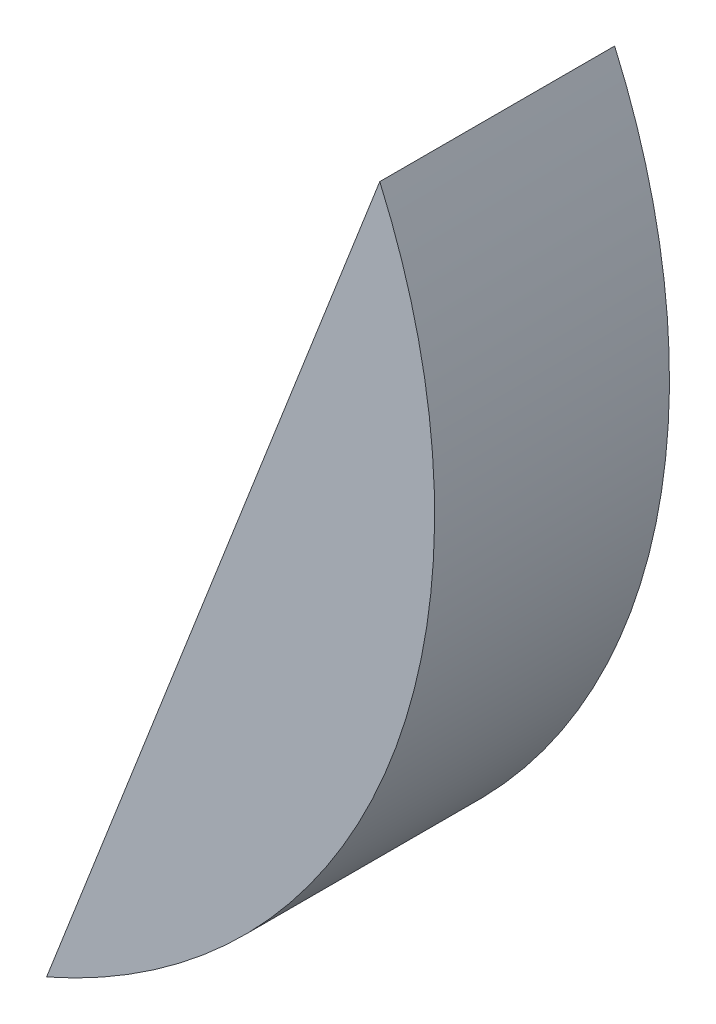
ISO-10303-21;
HEADER;
FILE_DESCRIPTION(('STEP AP214'),'2;1');
FILE_NAME('part.step','',(''),(''),'','','');
FILE_SCHEMA(('AUTOMOTIVE_DESIGN { 1 0 10303 214 1 1 1 1 }'));
ENDSEC;
DATA;
#1=APPLICATION_CONTEXT('core data for automotive mechanical design processes');
#2=APPLICATION_PROTOCOL_DEFINITION('international standard','automotive_design',2000,#1);
#3=PRODUCT_CONTEXT('',#1,'mechanical');
#4=PRODUCT('Part','Part','',(#3));
#5=PRODUCT_RELATED_PRODUCT_CATEGORY('part','',(#4));
#6=PRODUCT_DEFINITION_FORMATION('','',#4);
#7=PRODUCT_DEFINITION_CONTEXT('part definition',#1,'design');
#8=PRODUCT_DEFINITION('design','',#6,#7);
#9=PRODUCT_DEFINITION_SHAPE('','',#8);
#10=(LENGTH_UNIT() NAMED_UNIT(*) SI_UNIT(.MILLI.,.METRE.));
#11=(NAMED_UNIT(*) PLANE_ANGLE_UNIT() SI_UNIT($,.RADIAN.));
#12=(NAMED_UNIT(*) SI_UNIT($,.STERADIAN.) SOLID_ANGLE_UNIT());
#13=UNCERTAINTY_MEASURE_WITH_UNIT(LENGTH_MEASURE(1.E-05),#10,'distance_accuracy_value','');
#14=(GEOMETRIC_REPRESENTATION_CONTEXT(3) GLOBAL_UNCERTAINTY_ASSIGNED_CONTEXT((#13)) GLOBAL_UNIT_ASSIGNED_CONTEXT((#10,
#11,#12)) REPRESENTATION_CONTEXT('',''));
#15=CARTESIAN_POINT('',(0.,0.,0.));
#16=DIRECTION('',(0.,0.,1.));
#17=DIRECTION('',(1.,0.,0.));
#18=AXIS2_PLACEMENT_3D('',#15,#16,#17);
#19=CARTESIAN_POINT('',(-5.137,13.719,7.139));
#20=DIRECTION('',(0.,0.,-1.));
#21=DIRECTION('',(-1.,0.,0.));
#22=AXIS2_PLACEMENT_3D('',#19,#20,#21);
#23=CYLINDRICAL_SURFACE('',#22,19.731);
#24=CARTESIAN_POINT('',(-5.137,13.719,0.));
#25=DIRECTION('',(0.,0.,1.));
#26=DIRECTION('',(-1.,0.,0.));
#27=AXIS2_PLACEMENT_3D('',#24,#25,#26);
#28=CIRCLE('',#27,19.731);
#29=CARTESIAN_POINT('',(2.79982236875638,-4.34530767250183,0.));
#30=VERTEX_POINT('',#29);
#31=CARTESIAN_POINT('',(12.9273076725018,21.6558223687564,0.));
#32=VERTEX_POINT('',#31);
#33=EDGE_CURVE('E74',#30,#32,#28,.T.);
#34=ORIENTED_EDGE('',*,*,#33,.T.);
#35=DIRECTION('',(0.,0.,-1.));
#36=VECTOR('',#35,1.);
#37=CARTESIAN_POINT('',(12.9273076725018,21.6558223687564,7.139));
#38=LINE('',#37,#36);
#39=CARTESIAN_POINT('',(12.9273076725018,21.6558223687564,7.139));
#40=VERTEX_POINT('',#39);
#41=EDGE_CURVE('E11',#40,#32,#38,.T.);
#42=ORIENTED_EDGE('',*,*,#41,.F.);
#43=CARTESIAN_POINT('',(-5.137,13.719,7.139));
#44=DIRECTION('',(0.,0.,1.));
#45=DIRECTION('',(-1.,0.,0.));
#46=AXIS2_PLACEMENT_3D('',#43,#44,#45);
#47=CIRCLE('',#46,19.731);
#48=CARTESIAN_POINT('',(2.79982236875638,-4.34530767250183,7.139));
#49=VERTEX_POINT('',#48);
#50=EDGE_CURVE('E72',#49,#40,#47,.T.);
#51=ORIENTED_EDGE('',*,*,#50,.F.);
#52=DIRECTION('',(0.,0.,-1.));
#53=VECTOR('',#52,1.);
#54=CARTESIAN_POINT('',(2.79982236875638,-4.34530767250183,7.139));
#55=LINE('',#54,#53);
#56=EDGE_CURVE('E47',#49,#30,#55,.T.);
#57=ORIENTED_EDGE('',*,*,#56,.T.);
#58=EDGE_LOOP('',(#34,#42,#51,#57));
#59=FACE_BOUND('',#58,.T.);
#60=ADVANCED_FACE('F41',(#59),#23,.T.);
#61=CARTESIAN_POINT('',(2.79982236875638,-4.34530767250183,7.139));
#62=DIRECTION('',(0.931811635025439,-0.362942249994704,0.));
#63=DIRECTION('',(0.362942249994704,0.931811635025439,0.));
#64=AXIS2_PLACEMENT_3D('',#61,#62,#63);
#65=PLANE('',#64);
#66=DIRECTION('',(-0.362942249994704,-0.931811635025439,0.));
#67=VECTOR('',#66,1.);
#68=CARTESIAN_POINT('',(2.79982236875638,-4.34530767250183,0.));
#69=LINE('',#68,#67);
#70=EDGE_CURVE('E61',#32,#30,#69,.T.);
#71=ORIENTED_EDGE('',*,*,#70,.T.);
#72=ORIENTED_EDGE('',*,*,#56,.F.);
#73=DIRECTION('',(-0.362942249994704,-0.931811635025439,0.));
#74=VECTOR('',#73,1.);
#75=CARTESIAN_POINT('',(2.79982236875638,-4.34530767250183,7.139));
#76=LINE('',#75,#74);
#77=EDGE_CURVE('E57',#40,#49,#76,.T.);
#78=ORIENTED_EDGE('',*,*,#77,.F.);
#79=ORIENTED_EDGE('',*,*,#41,.T.);
#80=EDGE_LOOP('',(#71,#72,#78,#79));
#81=FACE_BOUND('',#80,.T.);
#82=ADVANCED_FACE('F70',(#81),#65,.F.);
#83=CARTESIAN_POINT('',(-5.137,13.719,7.139));
#84=DIRECTION('',(0.,0.,-1.));
#85=DIRECTION('',(-1.,0.,0.));
#86=AXIS2_PLACEMENT_3D('',#83,#84,#85);
#87=PLANE('',#86);
#88=ORIENTED_EDGE('',*,*,#50,.T.);
#89=ORIENTED_EDGE('',*,*,#77,.T.);
#90=EDGE_LOOP('',(#88,#89));
#91=FACE_BOUND('',#90,.T.);
#92=ADVANCED_FACE('F80',(#91),#87,.F.);
#93=CARTESIAN_POINT('',(-5.137,13.719,0.));
#94=DIRECTION('',(0.,0.,-1.));
#95=DIRECTION('',(-1.,0.,0.));
#96=AXIS2_PLACEMENT_3D('',#93,#94,#95);
#97=PLANE('',#96);
#98=ORIENTED_EDGE('',*,*,#33,.F.);
#99=ORIENTED_EDGE('',*,*,#70,.F.);
#100=EDGE_LOOP('',(#98,#99));
#101=FACE_BOUND('',#100,.T.);
#102=ADVANCED_FACE('F73',(#101),#97,.T.);
#103=CLOSED_SHELL('',(#60,#82,#92,#102));
#104=MANIFOLD_SOLID_BREP('B2',#103);
#105=ADVANCED_BREP_SHAPE_REPRESENTATION('',(#18,#104),#14);
#106=SHAPE_DEFINITION_REPRESENTATION(#9,#105);
ENDSEC;
END-ISO-10303-21;
